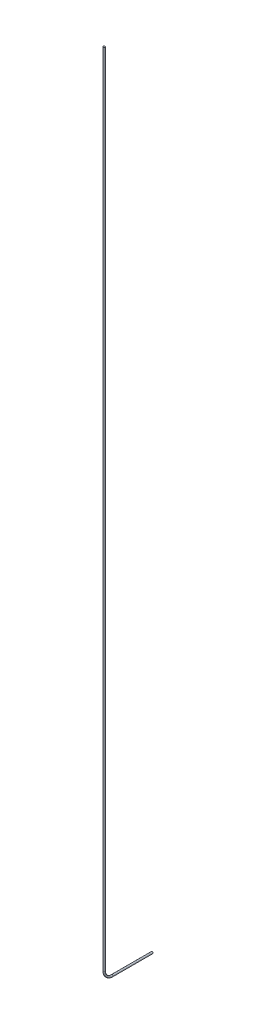
ISO-10303-21;
HEADER;
FILE_DESCRIPTION(('STEP AP214'),'2;1');
FILE_NAME('part.step','',(''),(''),'','','');
FILE_SCHEMA(('AUTOMOTIVE_DESIGN { 1 0 10303 214 1 1 1 1 }'));
ENDSEC;
DATA;
#1=APPLICATION_CONTEXT('core data for automotive mechanical design processes');
#2=APPLICATION_PROTOCOL_DEFINITION('international standard','automotive_design',2000,#1);
#3=PRODUCT_CONTEXT('',#1,'mechanical');
#4=PRODUCT('Part','Part','',(#3));
#5=PRODUCT_RELATED_PRODUCT_CATEGORY('part','',(#4));
#6=PRODUCT_DEFINITION_FORMATION('','',#4);
#7=PRODUCT_DEFINITION_CONTEXT('part definition',#1,'design');
#8=PRODUCT_DEFINITION('design','',#6,#7);
#9=PRODUCT_DEFINITION_SHAPE('','',#8);
#10=(LENGTH_UNIT() NAMED_UNIT(*) SI_UNIT(.MILLI.,.METRE.));
#11=(NAMED_UNIT(*) PLANE_ANGLE_UNIT() SI_UNIT($,.RADIAN.));
#12=(NAMED_UNIT(*) SI_UNIT($,.STERADIAN.) SOLID_ANGLE_UNIT());
#13=UNCERTAINTY_MEASURE_WITH_UNIT(LENGTH_MEASURE(1.E-05),#10,'distance_accuracy_value','');
#14=(GEOMETRIC_REPRESENTATION_CONTEXT(3) GLOBAL_UNCERTAINTY_ASSIGNED_CONTEXT((#13)) GLOBAL_UNIT_ASSIGNED_CONTEXT((#10,
#11,#12)) REPRESENTATION_CONTEXT('',''));
#15=CARTESIAN_POINT('',(0.,0.,0.));
#16=DIRECTION('',(0.,0.,1.));
#17=DIRECTION('',(1.,0.,0.));
#18=AXIS2_PLACEMENT_3D('',#15,#16,#17);
#19=CARTESIAN_POINT('',(0.,0.,20.));
#20=DIRECTION('',(0.,0.,-1.));
#21=DIRECTION('',(-1.,0.,0.));
#22=AXIS2_PLACEMENT_3D('',#19,#20,#21);
#23=CYLINDRICAL_SURFACE('',#22,0.57);
#24=CARTESIAN_POINT('',(0.,0.,0.));
#25=DIRECTION('',(0.,0.,1.));
#26=DIRECTION('',(1.,0.,0.));
#27=AXIS2_PLACEMENT_3D('',#24,#25,#26);
#28=CIRCLE('',#27,0.57);
#29=CARTESIAN_POINT('',(0.57,0.,0.));
#30=VERTEX_POINT('',#29);
#31=EDGE_CURVE('E10',#30,#30,#28,.T.);
#32=ORIENTED_EDGE('',*,*,#31,.T.);
#33=EDGE_LOOP('',(#32));
#34=FACE_BOUND('',#33,.T.);
#35=CARTESIAN_POINT('',(0.,0.,25.));
#36=DIRECTION('',(0.,0.,1.));
#37=DIRECTION('',(1.,0.,0.));
#38=AXIS2_PLACEMENT_3D('',#35,#36,#37);
#39=CIRCLE('',#38,0.57);
#40=CARTESIAN_POINT('',(0.,-0.569999999999836,25.));
#41=VERTEX_POINT('',#40);
#42=EDGE_CURVE('E56',#41,#41,#39,.T.);
#43=ORIENTED_EDGE('',*,*,#42,.F.);
#44=EDGE_LOOP('',(#43));
#45=FACE_BOUND('',#44,.T.);
#46=ADVANCED_FACE('F39',(#34,#45),#23,.T.);
#47=CARTESIAN_POINT('',(0.,0.,0.));
#48=DIRECTION('',(0.,0.,1.));
#49=DIRECTION('',(1.,0.,0.));
#50=AXIS2_PLACEMENT_3D('',#47,#48,#49);
#51=PLANE('',#50);
#52=ORIENTED_EDGE('',*,*,#31,.F.);
#53=EDGE_LOOP('',(#52));
#54=FACE_BOUND('',#53,.T.);
#55=ADVANCED_FACE('F66',(#54),#51,.F.);
#56=CARTESIAN_POINT('',(0.,505.,30.));
#57=DIRECTION('',(0.,1.,0.));
#58=DIRECTION('',(1.,0.,0.));
#59=AXIS2_PLACEMENT_3D('',#56,#57,#58);
#60=PLANE('',#59);
#61=CARTESIAN_POINT('',(0.,505.,30.));
#62=DIRECTION('',(0.,1.,0.));
#63=DIRECTION('',(1.,0.,0.));
#64=AXIS2_PLACEMENT_3D('',#61,#62,#63);
#65=CIRCLE('',#64,0.57);
#66=CARTESIAN_POINT('',(0.57,505.,30.));
#67=VERTEX_POINT('',#66);
#68=EDGE_CURVE('E46',#67,#67,#65,.T.);
#69=ORIENTED_EDGE('',*,*,#68,.T.);
#70=EDGE_LOOP('',(#69));
#71=FACE_BOUND('',#70,.T.);
#72=ADVANCED_FACE('F70',(#71),#60,.T.);
#73=CARTESIAN_POINT('',(0.,5.,25.));
#74=DIRECTION('',(-1.,0.,0.));
#75=DIRECTION('',(0.,0.,1.));
#76=AXIS2_PLACEMENT_3D('',#73,#74,#75);
#77=TOROIDAL_SURFACE('',#76,4.99999999999984,0.57);
#78=CARTESIAN_POINT('',(0.,5.,30.));
#79=DIRECTION('',(0.,1.,0.));
#80=DIRECTION('',(1.,0.,0.));
#81=AXIS2_PLACEMENT_3D('',#78,#79,#80);
#82=CIRCLE('',#81,0.57);
#83=CARTESIAN_POINT('',(0.,5.,30.5699999999998));
#84=VERTEX_POINT('',#83);
#85=EDGE_CURVE('E51',#84,#84,#82,.T.);
#86=CARTESIAN_POINT('',(0.,5.,25.));
#87=DIRECTION('',(-1.,0.,0.));
#88=DIRECTION('',(0.,0.,1.));
#89=AXIS2_PLACEMENT_3D('',#86,#87,#88);
#90=CIRCLE('',#89,5.56999999999984);
#91=EDGE_CURVE('',#41,#84,#90,.T.);
#92=ORIENTED_EDGE('',*,*,#42,.T.);
#93=ORIENTED_EDGE('',*,*,#85,.F.);
#94=ORIENTED_EDGE('',*,*,#91,.T.);
#95=ORIENTED_EDGE('',*,*,#91,.F.);
#96=EDGE_LOOP('',(#92,#94,#93,#95));
#97=FACE_BOUND('',#96,.T.);
#98=ADVANCED_FACE('F63',(#97),#77,.T.);
#99=CARTESIAN_POINT('',(0.,5.,30.));
#100=DIRECTION('',(0.,1.,0.));
#101=DIRECTION('',(0.,0.,1.));
#102=AXIS2_PLACEMENT_3D('',#99,#100,#101);
#103=CYLINDRICAL_SURFACE('',#102,0.57);
#104=ORIENTED_EDGE('',*,*,#68,.F.);
#105=EDGE_LOOP('',(#104));
#106=FACE_BOUND('',#105,.T.);
#107=ORIENTED_EDGE('',*,*,#85,.T.);
#108=EDGE_LOOP('',(#107));
#109=FACE_BOUND('',#108,.T.);
#110=ADVANCED_FACE('F72',(#106,#109),#103,.T.);
#111=CLOSED_SHELL('',(#46,#55,#72,#98,#110));
#112=MANIFOLD_SOLID_BREP('B2',#111);
#113=ADVANCED_BREP_SHAPE_REPRESENTATION('',(#18,#112),#14);
#114=SHAPE_DEFINITION_REPRESENTATION(#9,#113);
ENDSEC;
END-ISO-10303-21;
